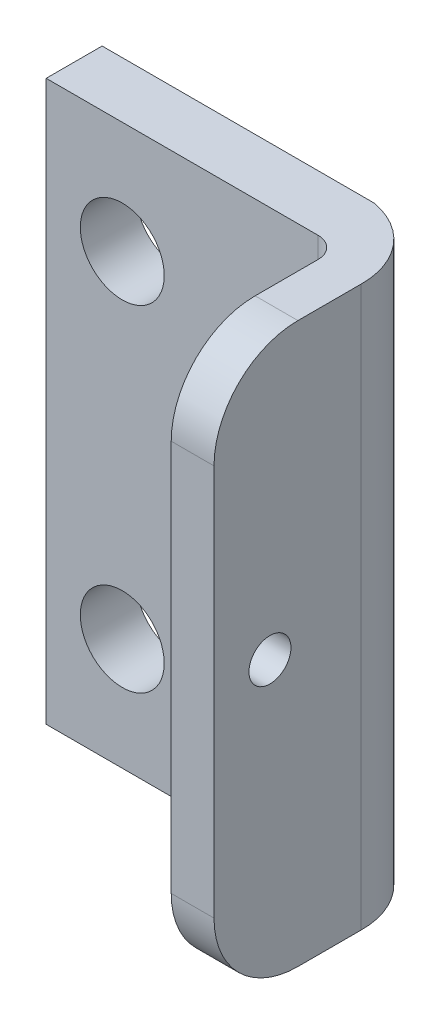
ISO-10303-21;
HEADER;
FILE_DESCRIPTION(('STEP AP214'),'2;1');
FILE_NAME('part.step','',(''),(''),'','','');
FILE_SCHEMA(('AUTOMOTIVE_DESIGN { 1 0 10303 214 1 1 1 1 }'));
ENDSEC;
DATA;
#1=APPLICATION_CONTEXT('core data for automotive mechanical design processes');
#2=APPLICATION_PROTOCOL_DEFINITION('international standard','automotive_design',2000,#1);
#3=PRODUCT_CONTEXT('',#1,'mechanical');
#4=PRODUCT('Part','Part','',(#3));
#5=PRODUCT_RELATED_PRODUCT_CATEGORY('part','',(#4));
#6=PRODUCT_DEFINITION_FORMATION('','',#4);
#7=PRODUCT_DEFINITION_CONTEXT('part definition',#1,'design');
#8=PRODUCT_DEFINITION('design','',#6,#7);
#9=PRODUCT_DEFINITION_SHAPE('','',#8);
#10=(LENGTH_UNIT() NAMED_UNIT(*) SI_UNIT(.MILLI.,.METRE.));
#11=(NAMED_UNIT(*) PLANE_ANGLE_UNIT() SI_UNIT($,.RADIAN.));
#12=(NAMED_UNIT(*) SI_UNIT($,.STERADIAN.) SOLID_ANGLE_UNIT());
#13=UNCERTAINTY_MEASURE_WITH_UNIT(LENGTH_MEASURE(1.E-05),#10,'distance_accuracy_value','');
#14=(GEOMETRIC_REPRESENTATION_CONTEXT(3) GLOBAL_UNCERTAINTY_ASSIGNED_CONTEXT((#13)) GLOBAL_UNIT_ASSIGNED_CONTEXT((#10,
#11,#12)) REPRESENTATION_CONTEXT('',''));
#15=CARTESIAN_POINT('',(0.,0.,0.));
#16=DIRECTION('',(0.,0.,1.));
#17=DIRECTION('',(1.,0.,0.));
#18=AXIS2_PLACEMENT_3D('',#15,#16,#17);
#19=CARTESIAN_POINT('',(0.,0.,2.));
#20=DIRECTION('',(0.,0.,-1.));
#21=DIRECTION('',(-1.,0.,0.));
#22=AXIS2_PLACEMENT_3D('',#19,#20,#21);
#23=PLANE('',#22);
#24=DIRECTION('',(0.,-1.,0.));
#25=VECTOR('',#24,1.);
#26=CARTESIAN_POINT('',(0.,0.,2.));
#27=LINE('',#26,#25);
#28=CARTESIAN_POINT('',(0.,20.,2.));
#29=VERTEX_POINT('',#28);
#30=CARTESIAN_POINT('',(0.,0.,2.));
#31=VERTEX_POINT('',#30);
#32=EDGE_CURVE('E79',#29,#31,#27,.T.);
#33=ORIENTED_EDGE('',*,*,#32,.T.);
#34=DIRECTION('',(1.,0.,0.));
#35=VECTOR('',#34,1.);
#36=CARTESIAN_POINT('',(0.,0.,2.));
#37=LINE('',#36,#35);
#38=CARTESIAN_POINT('',(9.72,0.,2.));
#39=VERTEX_POINT('',#38);
#40=EDGE_CURVE('E186',#31,#39,#37,.T.);
#41=ORIENTED_EDGE('',*,*,#40,.T.);
#42=DIRECTION('',(0.,1.,0.));
#43=VECTOR('',#42,1.);
#44=CARTESIAN_POINT('',(9.72,0.,2.));
#45=LINE('',#44,#43);
#46=CARTESIAN_POINT('',(9.72,20.,2.));
#47=VERTEX_POINT('',#46);
#48=EDGE_CURVE('E187',#39,#47,#45,.T.);
#49=ORIENTED_EDGE('',*,*,#48,.T.);
#50=DIRECTION('',(-1.,0.,0.));
#51=VECTOR('',#50,1.);
#52=CARTESIAN_POINT('',(0.,20.,2.));
#53=LINE('',#52,#51);
#54=EDGE_CURVE('E54',#47,#29,#53,.T.);
#55=ORIENTED_EDGE('',*,*,#54,.T.);
#56=EDGE_LOOP('',(#33,#41,#49,#55));
#57=FACE_BOUND('',#56,.T.);
#58=CARTESIAN_POINT('',(2.72,16.,2.));
#59=DIRECTION('',(0.,0.,1.));
#60=DIRECTION('',(1.,0.,0.));
#61=AXIS2_PLACEMENT_3D('',#58,#59,#60);
#62=CIRCLE('',#61,1.5);
#63=CARTESIAN_POINT('',(4.22,16.,2.));
#64=VERTEX_POINT('',#63);
#65=EDGE_CURVE('E91',#64,#64,#62,.T.);
#66=ORIENTED_EDGE('',*,*,#65,.F.);
#67=EDGE_LOOP('',(#66));
#68=FACE_BOUND('',#67,.T.);
#69=CARTESIAN_POINT('',(2.72,4.,2.));
#70=DIRECTION('',(0.,0.,1.));
#71=DIRECTION('',(1.,0.,0.));
#72=AXIS2_PLACEMENT_3D('',#69,#70,#71);
#73=CIRCLE('',#72,1.5);
#74=CARTESIAN_POINT('',(4.22,4.,2.));
#75=VERTEX_POINT('',#74);
#76=EDGE_CURVE('E178',#75,#75,#73,.T.);
#77=ORIENTED_EDGE('',*,*,#76,.F.);
#78=EDGE_LOOP('',(#77));
#79=FACE_BOUND('',#78,.T.);
#80=ADVANCED_FACE('F35',(#57,#68,#79),#23,.F.);
#81=CARTESIAN_POINT('',(0.,0.,0.));
#82=DIRECTION('',(0.,0.,-1.));
#83=DIRECTION('',(-1.,0.,0.));
#84=AXIS2_PLACEMENT_3D('',#81,#82,#83);
#85=PLANE('',#84);
#86=CARTESIAN_POINT('',(2.72,16.,0.));
#87=DIRECTION('',(0.,0.,1.));
#88=DIRECTION('',(1.,0.,0.));
#89=AXIS2_PLACEMENT_3D('',#86,#87,#88);
#90=CIRCLE('',#89,1.5);
#91=CARTESIAN_POINT('',(4.22,16.,0.));
#92=VERTEX_POINT('',#91);
#93=EDGE_CURVE('E95',#92,#92,#90,.T.);
#94=ORIENTED_EDGE('',*,*,#93,.T.);
#95=EDGE_LOOP('',(#94));
#96=FACE_BOUND('',#95,.T.);
#97=DIRECTION('',(0.,-1.,0.));
#98=VECTOR('',#97,1.);
#99=CARTESIAN_POINT('',(0.,0.,0.));
#100=LINE('',#99,#98);
#101=CARTESIAN_POINT('',(0.,20.,0.));
#102=VERTEX_POINT('',#101);
#103=CARTESIAN_POINT('',(0.,0.,0.));
#104=VERTEX_POINT('',#103);
#105=EDGE_CURVE('E85',#102,#104,#100,.T.);
#106=ORIENTED_EDGE('',*,*,#105,.F.);
#107=DIRECTION('',(-1.,0.,0.));
#108=VECTOR('',#107,1.);
#109=CARTESIAN_POINT('',(0.,20.,0.));
#110=LINE('',#109,#108);
#111=CARTESIAN_POINT('',(9.72,20.,0.));
#112=VERTEX_POINT('',#111);
#113=EDGE_CURVE('E72',#112,#102,#110,.T.);
#114=ORIENTED_EDGE('',*,*,#113,.F.);
#115=DIRECTION('',(0.,1.,0.));
#116=VECTOR('',#115,1.);
#117=CARTESIAN_POINT('',(9.72,0.,0.));
#118=LINE('',#117,#116);
#119=CARTESIAN_POINT('',(9.72,0.,0.));
#120=VERTEX_POINT('',#119);
#121=EDGE_CURVE('E80',#120,#112,#118,.T.);
#122=ORIENTED_EDGE('',*,*,#121,.F.);
#123=DIRECTION('',(1.,0.,0.));
#124=VECTOR('',#123,1.);
#125=CARTESIAN_POINT('',(0.,0.,0.));
#126=LINE('',#125,#124);
#127=EDGE_CURVE('E90',#104,#120,#126,.T.);
#128=ORIENTED_EDGE('',*,*,#127,.F.);
#129=EDGE_LOOP('',(#106,#114,#122,#128));
#130=FACE_BOUND('',#129,.T.);
#131=CARTESIAN_POINT('',(2.72,4.,0.));
#132=DIRECTION('',(0.,0.,1.));
#133=DIRECTION('',(1.,0.,0.));
#134=AXIS2_PLACEMENT_3D('',#131,#132,#133);
#135=CIRCLE('',#134,1.5);
#136=CARTESIAN_POINT('',(4.22,4.,0.));
#137=VERTEX_POINT('',#136);
#138=EDGE_CURVE('E177',#137,#137,#135,.T.);
#139=ORIENTED_EDGE('',*,*,#138,.T.);
#140=EDGE_LOOP('',(#139));
#141=FACE_BOUND('',#140,.T.);
#142=ADVANCED_FACE('F87',(#96,#130,#141),#85,.T.);
#143=CARTESIAN_POINT('',(0.,0.,2.));
#144=DIRECTION('',(1.,0.,0.));
#145=DIRECTION('',(0.,0.,-1.));
#146=AXIS2_PLACEMENT_3D('',#143,#144,#145);
#147=PLANE('',#146);
#148=ORIENTED_EDGE('',*,*,#105,.T.);
#149=DIRECTION('',(0.,0.,-1.));
#150=VECTOR('',#149,1.);
#151=CARTESIAN_POINT('',(0.,0.,2.));
#152=LINE('',#151,#150);
#153=EDGE_CURVE('E11',#31,#104,#152,.T.);
#154=ORIENTED_EDGE('',*,*,#153,.F.);
#155=ORIENTED_EDGE('',*,*,#32,.F.);
#156=DIRECTION('',(0.,0.,-1.));
#157=VECTOR('',#156,1.);
#158=CARTESIAN_POINT('',(0.,20.,2.));
#159=LINE('',#158,#157);
#160=EDGE_CURVE('E45',#29,#102,#159,.T.);
#161=ORIENTED_EDGE('',*,*,#160,.T.);
#162=EDGE_LOOP('',(#148,#154,#155,#161));
#163=FACE_BOUND('',#162,.T.);
#164=ADVANCED_FACE('F37',(#163),#147,.F.);
#165=CARTESIAN_POINT('',(0.,0.,2.));
#166=DIRECTION('',(0.,1.,0.));
#167=DIRECTION('',(0.,0.,1.));
#168=AXIS2_PLACEMENT_3D('',#165,#166,#167);
#169=PLANE('',#168);
#170=ORIENTED_EDGE('',*,*,#127,.T.);
#171=CARTESIAN_POINT('',(9.25,0.,2.70953870612693));
#172=DIRECTION('',(0.,-1.,0.));
#173=DIRECTION('',(0.,0.,-1.));
#174=AXIS2_PLACEMENT_3D('',#171,#172,#173);
#175=CIRCLE('',#174,2.75);
#176=CARTESIAN_POINT('',(11.9998511631899,0.,2.75));
#177=VERTEX_POINT('',#176);
#178=EDGE_CURVE('E153',#120,#177,#175,.T.);
#179=ORIENTED_EDGE('',*,*,#178,.T.);
#180=DIRECTION('',(0.,0.,-1.));
#181=VECTOR('',#180,1.);
#182=CARTESIAN_POINT('',(12.,0.,4.99999999999998));
#183=LINE('',#182,#181);
#184=CARTESIAN_POINT('',(12.,0.,4.99999999999998));
#185=VERTEX_POINT('',#184);
#186=EDGE_CURVE('E208',#185,#177,#183,.T.);
#187=ORIENTED_EDGE('',*,*,#186,.F.);
#188=DIRECTION('',(1.,0.,0.));
#189=VECTOR('',#188,1.);
#190=CARTESIAN_POINT('',(10.47,0.,4.99999999999998));
#191=LINE('',#190,#189);
#192=CARTESIAN_POINT('',(10.47,0.,4.99999999999998));
#193=VERTEX_POINT('',#192);
#194=EDGE_CURVE('E163',#193,#185,#191,.T.);
#195=ORIENTED_EDGE('',*,*,#194,.F.);
#196=DIRECTION('',(0.,0.,-1.));
#197=VECTOR('',#196,1.);
#198=CARTESIAN_POINT('',(10.47,0.,4.99999999999998));
#199=LINE('',#198,#197);
#200=CARTESIAN_POINT('',(10.47,0.,2.75));
#201=VERTEX_POINT('',#200);
#202=EDGE_CURVE('E223',#193,#201,#199,.T.);
#203=ORIENTED_EDGE('',*,*,#202,.T.);
#204=CARTESIAN_POINT('',(9.72,0.,2.75));
#205=DIRECTION('',(0.,1.,0.));
#206=DIRECTION('',(0.,0.,-1.));
#207=AXIS2_PLACEMENT_3D('',#204,#205,#206);
#208=CIRCLE('',#207,0.75);
#209=EDGE_CURVE('E159',#201,#39,#208,.T.);
#210=ORIENTED_EDGE('',*,*,#209,.T.);
#211=ORIENTED_EDGE('',*,*,#40,.F.);
#212=ORIENTED_EDGE('',*,*,#153,.T.);
#213=EDGE_LOOP('',(#170,#179,#187,#195,#203,#210,#211,#212));
#214=FACE_BOUND('',#213,.T.);
#215=ADVANCED_FACE('F145',(#214),#169,.F.);
#216=CARTESIAN_POINT('',(0.,20.,2.));
#217=DIRECTION('',(0.,-1.,0.));
#218=DIRECTION('',(0.,0.,-1.));
#219=AXIS2_PLACEMENT_3D('',#216,#217,#218);
#220=PLANE('',#219);
#221=ORIENTED_EDGE('',*,*,#113,.T.);
#222=ORIENTED_EDGE('',*,*,#160,.F.);
#223=ORIENTED_EDGE('',*,*,#54,.F.);
#224=CARTESIAN_POINT('',(9.72,20.,2.75));
#225=DIRECTION('',(0.,1.,0.));
#226=DIRECTION('',(0.,0.,-1.));
#227=AXIS2_PLACEMENT_3D('',#224,#225,#226);
#228=CIRCLE('',#227,0.75);
#229=CARTESIAN_POINT('',(10.47,20.,2.75));
#230=VERTEX_POINT('',#229);
#231=EDGE_CURVE('E158',#230,#47,#228,.T.);
#232=ORIENTED_EDGE('',*,*,#231,.F.);
#233=DIRECTION('',(0.,0.,1.));
#234=VECTOR('',#233,1.);
#235=CARTESIAN_POINT('',(10.47,20.,2.75));
#236=LINE('',#235,#234);
#237=CARTESIAN_POINT('',(10.47,20.,4.99999999999998));
#238=VERTEX_POINT('',#237);
#239=EDGE_CURVE('E197',#230,#238,#236,.T.);
#240=ORIENTED_EDGE('',*,*,#239,.T.);
#241=DIRECTION('',(1.,0.,0.));
#242=VECTOR('',#241,1.);
#243=CARTESIAN_POINT('',(10.47,20.,4.99999999999998));
#244=LINE('',#243,#242);
#245=CARTESIAN_POINT('',(12.,20.,4.99999999999998));
#246=VERTEX_POINT('',#245);
#247=EDGE_CURVE('E225',#238,#246,#244,.T.);
#248=ORIENTED_EDGE('',*,*,#247,.T.);
#249=DIRECTION('',(0.,0.,1.));
#250=VECTOR('',#249,1.);
#251=CARTESIAN_POINT('',(12.,20.,2.75));
#252=LINE('',#251,#250);
#253=CARTESIAN_POINT('',(11.9998511631899,20.,2.75));
#254=VERTEX_POINT('',#253);
#255=EDGE_CURVE('E230',#254,#246,#252,.T.);
#256=ORIENTED_EDGE('',*,*,#255,.F.);
#257=CARTESIAN_POINT('',(9.25,20.,2.70953870612693));
#258=DIRECTION('',(0.,-1.,0.));
#259=DIRECTION('',(0.,0.,-1.));
#260=AXIS2_PLACEMENT_3D('',#257,#258,#259);
#261=CIRCLE('',#260,2.75);
#262=EDGE_CURVE('E69',#112,#254,#261,.T.);
#263=ORIENTED_EDGE('',*,*,#262,.F.);
#264=EDGE_LOOP('',(#221,#222,#223,#232,#240,#248,#256,#263));
#265=FACE_BOUND('',#264,.T.);
#266=ADVANCED_FACE('F74',(#265),#220,.F.);
#267=CARTESIAN_POINT('',(2.72,16.,2.));
#268=DIRECTION('',(0.,0.,-1.));
#269=DIRECTION('',(-1.,0.,0.));
#270=AXIS2_PLACEMENT_3D('',#267,#268,#269);
#271=CYLINDRICAL_SURFACE('',#270,1.5);
#272=ORIENTED_EDGE('',*,*,#65,.T.);
#273=EDGE_LOOP('',(#272));
#274=FACE_BOUND('',#273,.T.);
#275=ORIENTED_EDGE('',*,*,#93,.F.);
#276=EDGE_LOOP('',(#275));
#277=FACE_BOUND('',#276,.T.);
#278=ADVANCED_FACE('F134',(#274,#277),#271,.F.);
#279=CARTESIAN_POINT('',(2.72,4.,2.));
#280=DIRECTION('',(0.,0.,-1.));
#281=DIRECTION('',(-1.,0.,0.));
#282=AXIS2_PLACEMENT_3D('',#279,#280,#281);
#283=CYLINDRICAL_SURFACE('',#282,1.5);
#284=ORIENTED_EDGE('',*,*,#76,.T.);
#285=EDGE_LOOP('',(#284));
#286=FACE_BOUND('',#285,.T.);
#287=ORIENTED_EDGE('',*,*,#138,.F.);
#288=EDGE_LOOP('',(#287));
#289=FACE_BOUND('',#288,.T.);
#290=ADVANCED_FACE('F130',(#286,#289),#283,.F.);
#291=CARTESIAN_POINT('',(9.72,20.,2.75));
#292=DIRECTION('',(0.,-1.,0.));
#293=DIRECTION('',(0.,0.,-1.));
#294=AXIS2_PLACEMENT_3D('',#291,#292,#293);
#295=CYLINDRICAL_SURFACE('',#294,0.75);
#296=ORIENTED_EDGE('',*,*,#209,.F.);
#297=DIRECTION('',(0.,-1.,0.));
#298=VECTOR('',#297,1.);
#299=CARTESIAN_POINT('',(10.47,20.,2.75));
#300=LINE('',#299,#298);
#301=EDGE_CURVE('E174',#230,#201,#300,.T.);
#302=ORIENTED_EDGE('',*,*,#301,.F.);
#303=ORIENTED_EDGE('',*,*,#231,.T.);
#304=ORIENTED_EDGE('',*,*,#48,.F.);
#305=EDGE_LOOP('',(#296,#302,#303,#304));
#306=FACE_BOUND('',#305,.T.);
#307=ADVANCED_FACE('F125',(#306),#295,.F.);
#308=CARTESIAN_POINT('',(9.25,20.,2.70953870612693));
#309=DIRECTION('',(0.,-1.,0.));
#310=DIRECTION('',(0.,0.,-1.));
#311=AXIS2_PLACEMENT_3D('',#308,#309,#310);
#312=CYLINDRICAL_SURFACE('',#311,2.75);
#313=ORIENTED_EDGE('',*,*,#178,.F.);
#314=ORIENTED_EDGE('',*,*,#121,.T.);
#315=ORIENTED_EDGE('',*,*,#262,.T.);
#316=CARTESIAN_POINT('',(11.9997023263797,20.,2.75));
#317=DIRECTION('',(0.,-1.,0.));
#318=VECTOR('',#317,1.);
#319=LINE('',#316,#318);
#320=EDGE_CURVE('E107',#254,#177,#319,.T.);
#321=ORIENTED_EDGE('',*,*,#320,.T.);
#322=EDGE_LOOP('',(#313,#314,#315,#321));
#323=FACE_BOUND('',#322,.T.);
#324=ADVANCED_FACE('F114',(#323),#312,.T.);
#325=CARTESIAN_POINT('',(10.47,3.,5.));
#326=DIRECTION('',(1.,0.,0.));
#327=DIRECTION('',(0.,0.,-1.));
#328=AXIS2_PLACEMENT_3D('',#325,#326,#327);
#329=CYLINDRICAL_SURFACE('',#328,3.);
#330=CARTESIAN_POINT('',(12.,3.,5.));
#331=DIRECTION('',(1.,0.,0.));
#332=DIRECTION('',(0.,0.,-1.));
#333=AXIS2_PLACEMENT_3D('',#330,#331,#332);
#334=CIRCLE('',#333,3.);
#335=CARTESIAN_POINT('',(12.,3.00000000000002,8.));
#336=VERTEX_POINT('',#335);
#337=EDGE_CURVE('E212',#336,#185,#334,.T.);
#338=ORIENTED_EDGE('',*,*,#337,.F.);
#339=DIRECTION('',(1.,0.,0.));
#340=VECTOR('',#339,1.);
#341=CARTESIAN_POINT('',(10.47,3.00000000000002,8.));
#342=LINE('',#341,#340);
#343=CARTESIAN_POINT('',(10.47,3.00000000000002,8.));
#344=VERTEX_POINT('',#343);
#345=EDGE_CURVE('E170',#344,#336,#342,.T.);
#346=ORIENTED_EDGE('',*,*,#345,.F.);
#347=CARTESIAN_POINT('',(10.47,3.,5.));
#348=DIRECTION('',(1.,0.,0.));
#349=DIRECTION('',(0.,0.,-1.));
#350=AXIS2_PLACEMENT_3D('',#347,#348,#349);
#351=CIRCLE('',#350,3.);
#352=EDGE_CURVE('E220',#344,#193,#351,.T.);
#353=ORIENTED_EDGE('',*,*,#352,.T.);
#354=ORIENTED_EDGE('',*,*,#194,.T.);
#355=EDGE_LOOP('',(#338,#346,#353,#354));
#356=FACE_BOUND('',#355,.T.);
#357=ADVANCED_FACE('F124',(#356),#329,.T.);
#358=CARTESIAN_POINT('',(10.47,17.,8.));
#359=DIRECTION('',(0.,0.,1.));
#360=DIRECTION('',(0.,-1.,0.));
#361=AXIS2_PLACEMENT_3D('',#358,#359,#360);
#362=PLANE('',#361);
#363=DIRECTION('',(0.,-1.,0.));
#364=VECTOR('',#363,1.);
#365=CARTESIAN_POINT('',(12.,17.,8.));
#366=LINE('',#365,#364);
#367=CARTESIAN_POINT('',(12.,17.,8.));
#368=VERTEX_POINT('',#367);
#369=EDGE_CURVE('E229',#368,#336,#366,.T.);
#370=ORIENTED_EDGE('',*,*,#369,.F.);
#371=DIRECTION('',(1.,0.,0.));
#372=VECTOR('',#371,1.);
#373=CARTESIAN_POINT('',(10.47,17.,8.));
#374=LINE('',#373,#372);
#375=CARTESIAN_POINT('',(10.47,17.,8.));
#376=VERTEX_POINT('',#375);
#377=EDGE_CURVE('E237',#376,#368,#374,.T.);
#378=ORIENTED_EDGE('',*,*,#377,.F.);
#379=DIRECTION('',(0.,-1.,0.));
#380=VECTOR('',#379,1.);
#381=CARTESIAN_POINT('',(10.47,17.,8.));
#382=LINE('',#381,#380);
#383=EDGE_CURVE('E210',#376,#344,#382,.T.);
#384=ORIENTED_EDGE('',*,*,#383,.T.);
#385=ORIENTED_EDGE('',*,*,#345,.T.);
#386=EDGE_LOOP('',(#370,#378,#384,#385));
#387=FACE_BOUND('',#386,.T.);
#388=ADVANCED_FACE('F262',(#387),#362,.T.);
#389=CARTESIAN_POINT('',(10.47,17.,5.));
#390=DIRECTION('',(1.,0.,0.));
#391=DIRECTION('',(0.,0.,-1.));
#392=AXIS2_PLACEMENT_3D('',#389,#390,#391);
#393=CYLINDRICAL_SURFACE('',#392,3.);
#394=CARTESIAN_POINT('',(12.,17.,5.));
#395=DIRECTION('',(1.,0.,0.));
#396=DIRECTION('',(0.,0.,-1.));
#397=AXIS2_PLACEMENT_3D('',#394,#395,#396);
#398=CIRCLE('',#397,3.);
#399=EDGE_CURVE('E226',#246,#368,#398,.T.);
#400=ORIENTED_EDGE('',*,*,#399,.F.);
#401=ORIENTED_EDGE('',*,*,#247,.F.);
#402=CARTESIAN_POINT('',(10.47,17.,5.));
#403=DIRECTION('',(1.,0.,0.));
#404=DIRECTION('',(0.,0.,-1.));
#405=AXIS2_PLACEMENT_3D('',#402,#403,#404);
#406=CIRCLE('',#405,3.);
#407=EDGE_CURVE('E207',#238,#376,#406,.T.);
#408=ORIENTED_EDGE('',*,*,#407,.T.);
#409=ORIENTED_EDGE('',*,*,#377,.T.);
#410=EDGE_LOOP('',(#400,#401,#408,#409));
#411=FACE_BOUND('',#410,.T.);
#412=ADVANCED_FACE('F126',(#411),#393,.T.);
#413=CARTESIAN_POINT('',(10.47,3.,5.));
#414=DIRECTION('',(1.,0.,0.));
#415=DIRECTION('',(0.,0.,-1.));
#416=AXIS2_PLACEMENT_3D('',#413,#414,#415);
#417=PLANE('',#416);
#418=CARTESIAN_POINT('',(10.47,10.,6.));
#419=DIRECTION('',(1.,0.,0.));
#420=DIRECTION('',(0.,0.,-1.));
#421=AXIS2_PLACEMENT_3D('',#418,#419,#420);
#422=CIRCLE('',#421,0.750000000000001);
#423=CARTESIAN_POINT('',(10.47,10.,5.25));
#424=VERTEX_POINT('',#423);
#425=EDGE_CURVE('E296',#424,#424,#422,.T.);
#426=ORIENTED_EDGE('',*,*,#425,.T.);
#427=EDGE_LOOP('',(#426));
#428=FACE_BOUND('',#427,.T.);
#429=ORIENTED_EDGE('',*,*,#301,.T.);
#430=ORIENTED_EDGE('',*,*,#202,.F.);
#431=ORIENTED_EDGE('',*,*,#352,.F.);
#432=ORIENTED_EDGE('',*,*,#383,.F.);
#433=ORIENTED_EDGE('',*,*,#407,.F.);
#434=ORIENTED_EDGE('',*,*,#239,.F.);
#435=EDGE_LOOP('',(#429,#430,#431,#432,#433,#434));
#436=FACE_BOUND('',#435,.T.);
#437=ADVANCED_FACE('F202',(#428,#436),#417,.F.);
#438=CARTESIAN_POINT('',(12.,3.,5.));
#439=DIRECTION('',(1.,0.,0.));
#440=DIRECTION('',(0.,0.,-1.));
#441=AXIS2_PLACEMENT_3D('',#438,#439,#440);
#442=PLANE('',#441);
#443=CARTESIAN_POINT('',(12.,10.,6.));
#444=DIRECTION('',(1.,0.,0.));
#445=DIRECTION('',(0.,0.,-1.));
#446=AXIS2_PLACEMENT_3D('',#443,#444,#445);
#447=CIRCLE('',#446,0.750000000000001);
#448=CARTESIAN_POINT('',(12.,10.,5.25));
#449=VERTEX_POINT('',#448);
#450=EDGE_CURVE('E215',#449,#449,#447,.T.);
#451=ORIENTED_EDGE('',*,*,#450,.F.);
#452=EDGE_LOOP('',(#451));
#453=FACE_BOUND('',#452,.T.);
#454=ORIENTED_EDGE('',*,*,#320,.F.);
#455=ORIENTED_EDGE('',*,*,#255,.T.);
#456=ORIENTED_EDGE('',*,*,#399,.T.);
#457=ORIENTED_EDGE('',*,*,#369,.T.);
#458=ORIENTED_EDGE('',*,*,#337,.T.);
#459=ORIENTED_EDGE('',*,*,#186,.T.);
#460=EDGE_LOOP('',(#454,#455,#456,#457,#458,#459));
#461=FACE_BOUND('',#460,.T.);
#462=ADVANCED_FACE('F248',(#453,#461),#442,.T.);
#463=CARTESIAN_POINT('',(10.47,10.,6.));
#464=DIRECTION('',(1.,0.,0.));
#465=DIRECTION('',(0.,0.,-1.));
#466=AXIS2_PLACEMENT_3D('',#463,#464,#465);
#467=CYLINDRICAL_SURFACE('',#466,0.750000000000001);
#468=ORIENTED_EDGE('',*,*,#425,.F.);
#469=EDGE_LOOP('',(#468));
#470=FACE_BOUND('',#469,.T.);
#471=ORIENTED_EDGE('',*,*,#450,.T.);
#472=EDGE_LOOP('',(#471));
#473=FACE_BOUND('',#472,.T.);
#474=ADVANCED_FACE('F258',(#470,#473),#467,.F.);
#475=CLOSED_SHELL('',(#80,#142,#164,#215,#266,#278,#290,#307,#324,#357,#388,#412,#437,#462,#474));
#476=MANIFOLD_SOLID_BREP('B2',#475);
#477=ADVANCED_BREP_SHAPE_REPRESENTATION('',(#18,#476),#14);
#478=SHAPE_DEFINITION_REPRESENTATION(#9,#477);
ENDSEC;
END-ISO-10303-21;
